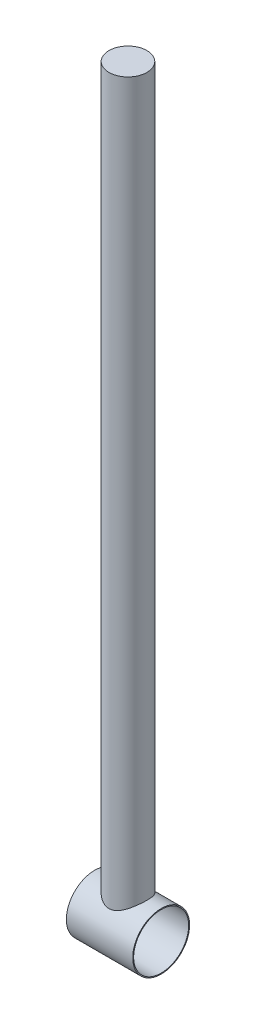
ISO-10303-21;
HEADER;
FILE_DESCRIPTION(('STEP AP214'),'2;1');
FILE_NAME('part.step','',(''),(''),'','','');
FILE_SCHEMA(('AUTOMOTIVE_DESIGN { 1 0 10303 214 1 1 1 1 }'));
ENDSEC;
DATA;
#1=APPLICATION_CONTEXT('core data for automotive mechanical design processes');
#2=APPLICATION_PROTOCOL_DEFINITION('international standard','automotive_design',2000,#1);
#3=PRODUCT_CONTEXT('',#1,'mechanical');
#4=PRODUCT('Part','Part','',(#3));
#5=PRODUCT_RELATED_PRODUCT_CATEGORY('part','',(#4));
#6=PRODUCT_DEFINITION_FORMATION('','',#4);
#7=PRODUCT_DEFINITION_CONTEXT('part definition',#1,'design');
#8=PRODUCT_DEFINITION('design','',#6,#7);
#9=PRODUCT_DEFINITION_SHAPE('','',#8);
#10=(LENGTH_UNIT() NAMED_UNIT(*) SI_UNIT(.MILLI.,.METRE.));
#11=(NAMED_UNIT(*) PLANE_ANGLE_UNIT() SI_UNIT($,.RADIAN.));
#12=(NAMED_UNIT(*) SI_UNIT($,.STERADIAN.) SOLID_ANGLE_UNIT());
#13=UNCERTAINTY_MEASURE_WITH_UNIT(LENGTH_MEASURE(1.E-05),#10,'distance_accuracy_value','');
#14=(GEOMETRIC_REPRESENTATION_CONTEXT(3) GLOBAL_UNCERTAINTY_ASSIGNED_CONTEXT((#13)) GLOBAL_UNIT_ASSIGNED_CONTEXT((#10,
#11,#12)) REPRESENTATION_CONTEXT('',''));
#15=CARTESIAN_POINT('',(0.,0.,0.));
#16=DIRECTION('',(0.,0.,1.));
#17=DIRECTION('',(1.,0.,0.));
#18=AXIS2_PLACEMENT_3D('',#15,#16,#17);
#19=CARTESIAN_POINT('',(35.,0.,0.));
#20=DIRECTION('',(1.,0.,0.));
#21=DIRECTION('',(0.,0.,-1.));
#22=AXIS2_PLACEMENT_3D('',#19,#20,#21);
#23=PLANE('',#22);
#24=CARTESIAN_POINT('',(35.,0.,0.));
#25=DIRECTION('',(1.,0.,0.));
#26=DIRECTION('',(0.,0.,-1.));
#27=AXIS2_PLACEMENT_3D('',#24,#25,#26);
#28=CIRCLE('',#27,30.);
#29=CARTESIAN_POINT('',(35.,0.,-30.));
#30=VERTEX_POINT('',#29);
#31=EDGE_CURVE('E10',#30,#30,#28,.T.);
#32=ORIENTED_EDGE('',*,*,#31,.T.);
#33=EDGE_LOOP('',(#32));
#34=FACE_BOUND('',#33,.T.);
#35=CARTESIAN_POINT('',(35.,0.,0.));
#36=DIRECTION('',(1.,0.,0.));
#37=DIRECTION('',(0.,0.,-1.));
#38=AXIS2_PLACEMENT_3D('',#35,#36,#37);
#39=CIRCLE('',#38,29.);
#40=CARTESIAN_POINT('',(35.,0.,-29.));
#41=VERTEX_POINT('',#40);
#42=EDGE_CURVE('E43',#41,#41,#39,.T.);
#43=ORIENTED_EDGE('',*,*,#42,.F.);
#44=EDGE_LOOP('',(#43));
#45=FACE_BOUND('',#44,.T.);
#46=ADVANCED_FACE('F32',(#34,#45),#23,.T.);
#47=CARTESIAN_POINT('',(-35.,0.,0.));
#48=DIRECTION('',(1.,0.,0.));
#49=DIRECTION('',(0.,0.,-1.));
#50=AXIS2_PLACEMENT_3D('',#47,#48,#49);
#51=PLANE('',#50);
#52=CARTESIAN_POINT('',(-35.,0.,0.));
#53=DIRECTION('',(1.,0.,0.));
#54=DIRECTION('',(0.,0.,-1.));
#55=AXIS2_PLACEMENT_3D('',#52,#53,#54);
#56=CIRCLE('',#55,30.);
#57=CARTESIAN_POINT('',(-35.,0.,-30.));
#58=VERTEX_POINT('',#57);
#59=EDGE_CURVE('E36',#58,#58,#56,.T.);
#60=ORIENTED_EDGE('',*,*,#59,.F.);
#61=EDGE_LOOP('',(#60));
#62=FACE_BOUND('',#61,.T.);
#63=CARTESIAN_POINT('',(-35.,0.,0.));
#64=DIRECTION('',(1.,0.,0.));
#65=DIRECTION('',(0.,0.,-1.));
#66=AXIS2_PLACEMENT_3D('',#63,#64,#65);
#67=CIRCLE('',#66,29.);
#68=CARTESIAN_POINT('',(-35.,0.,-29.));
#69=VERTEX_POINT('',#68);
#70=EDGE_CURVE('E45',#69,#69,#67,.T.);
#71=ORIENTED_EDGE('',*,*,#70,.T.);
#72=EDGE_LOOP('',(#71));
#73=FACE_BOUND('',#72,.T.);
#74=ADVANCED_FACE('F75',(#62,#73),#51,.F.);
#75=CARTESIAN_POINT('',(35.,0.,0.));
#76=DIRECTION('',(-1.,0.,0.));
#77=DIRECTION('',(0.,0.,1.));
#78=AXIS2_PLACEMENT_3D('',#75,#76,#77);
#79=CYLINDRICAL_SURFACE('',#78,30.);
#80=CARTESIAN_POINT('',(0.,22.3606797749979,20.));
#81=CARTESIAN_POINT('',(0.488208956169302,22.3606858935288,19.9999964119226));
#82=CARTESIAN_POINT('',(0.976468291774058,22.3767415723571,19.9820866285813));
#83=CARTESIAN_POINT('',(1.94835881250643,22.4401594085095,19.9108373861768));
#84=CARTESIAN_POINT('',(2.43198924712352,22.4875265581483,19.8574922772833));
#85=CARTESIAN_POINT('',(3.39112332136817,22.6113496939203,19.7163799196857));
#86=CARTESIAN_POINT('',(3.8666135294044,22.6878496694561,19.6285606101056));
#87=CARTESIAN_POINT('',(4.80533737323533,22.8665434498395,19.4200919600602));
#88=CARTESIAN_POINT('',(5.26857077190595,22.9687377513765,19.2994419849513));
#89=CARTESIAN_POINT('',(6.17578513914899,23.193728226989,19.0284426273943));
#90=CARTESIAN_POINT('',(6.6199111296105,23.3163108203906,18.8783985352891));
#91=CARTESIAN_POINT('',(7.49212487931457,23.5787801839215,18.5495380856482));
#92=CARTESIAN_POINT('',(7.92020999413462,23.7186697909934,18.3707170095788));
#93=CARTESIAN_POINT('',(8.75912421482544,24.0118255935988,17.9858478768931));
#94=CARTESIAN_POINT('',(9.16995442032433,24.1650909347959,17.7798015587787));
#95=CARTESIAN_POINT('',(9.97362051230805,24.4813525241294,17.3417522052945));
#96=CARTESIAN_POINT('',(10.3664551510918,24.644349445194,17.1097473739498));
#97=CARTESIAN_POINT('',(11.1932268211757,25.00257367896,16.5827611461459));
#98=CARTESIAN_POINT('',(11.6240409428177,25.1988679806497,16.2835985891376));
#99=CARTESIAN_POINT('',(12.4598274059487,25.5951544496233,15.6533280846079));
#100=CARTESIAN_POINT('',(12.8647979980787,25.7951468660549,15.3222179783466));
#101=CARTESIAN_POINT('',(13.6481434866574,26.194621993879,14.6288076134715));
#102=CARTESIAN_POINT('',(14.0264936382841,26.3941040691864,14.2664790139786));
#103=CARTESIAN_POINT('',(14.7548145893199,26.788258639696,13.5118632099609));
#104=CARTESIAN_POINT('',(15.1047834311923,26.9829308025026,13.1195739425843));
#105=CARTESIAN_POINT('',(15.8231340954399,27.3910931463656,12.2471310095378));
#106=CARTESIAN_POINT('',(16.1868495528045,27.6032288530363,11.7624780965832));
#107=CARTESIAN_POINT('',(16.8717372344808,28.0103500677694,10.7570654072488));
#108=CARTESIAN_POINT('',(17.1929043262227,28.2053335058183,10.2363012863295));
#109=CARTESIAN_POINT('',(17.7887598687195,28.5724511444835,9.1617184714881));
#110=CARTESIAN_POINT('',(18.0634871779264,28.7446044219641,8.60792794262454));
#111=CARTESIAN_POINT('',(18.5627727588207,29.0609568759301,7.4705384998476));
#112=CARTESIAN_POINT('',(18.7873417767955,29.205162039351,6.88694600391358));
#113=CARTESIAN_POINT('',(19.1602240381012,29.4464999554022,5.76165832972233));
#114=CARTESIAN_POINT('',(19.3142641521887,29.5470977395677,5.22260227045826));
#115=CARTESIAN_POINT('',(19.5772038937651,29.7196407127317,4.12906673821278));
#116=CARTESIAN_POINT('',(19.6861065662819,29.7915878345267,3.57458830833749));
#117=CARTESIAN_POINT('',(19.8566974647913,29.904587508942,2.45588842993637));
#118=CARTESIAN_POINT('',(19.9184351137685,29.9456724005222,1.89167781543662));
#119=CARTESIAN_POINT('',(19.9936647349202,29.9957633041667,0.7586590887696));
#120=CARTESIAN_POINT('',(20.007163514351,30.0047738424215,0.189851636642885));
#121=CARTESIAN_POINT('',(19.9873184370662,29.9915473981852,-0.859806415927934));
#122=CARTESIAN_POINT('',(19.9607940358833,29.9738593639155,-1.34086232409546));
#123=CARTESIAN_POINT('',(19.873310019839,29.9156709892741,-2.2983895351906));
#124=CARTESIAN_POINT('',(19.8123548499873,29.8751735935912,-2.7748614218412));
#125=CARTESIAN_POINT('',(19.6568520909165,29.7722764488344,-3.7198828753724));
#126=CARTESIAN_POINT('',(19.5623030441721,29.7098757494512,-4.18843209759108));
#127=CARTESIAN_POINT('',(19.3408382238798,29.5645234505635,-5.11455664152083));
#128=CARTESIAN_POINT('',(19.2139210515152,29.4815709628999,-5.57213148802944));
#129=CARTESIAN_POINT('',(18.9298040334638,29.2971987002846,-6.47179810816159));
#130=CARTESIAN_POINT('',(18.7727295883957,29.1958554904912,-6.91394533614488));
#131=CARTESIAN_POINT('',(18.4296096664266,28.9764235265008,-7.78251525709052));
#132=CARTESIAN_POINT('',(18.2435647019401,28.858335068488,-8.20893822800989));
#133=CARTESIAN_POINT('',(17.8441778455769,28.6075257726395,-9.04431763466509));
#134=CARTESIAN_POINT('',(17.6308352556287,28.4748045606182,-9.45327362336785));
#135=CARTESIAN_POINT('',(17.1784769804029,28.1969539999433,-10.2523545489443));
#136=CARTESIAN_POINT('',(16.9394582795807,28.0518231942476,-10.6424772661187));
#137=CARTESIAN_POINT('',(16.4042840153249,27.7317267401802,-11.4527356062426));
#138=CARTESIAN_POINT('',(16.1047473885238,27.5553463717531,-11.8700812163928));
#139=CARTESIAN_POINT('',(15.4767499308217,27.1930871485775,-12.6780149842778));
#140=CARTESIAN_POINT('',(15.1482869484778,27.007207587744,-13.0686011478891));
#141=CARTESIAN_POINT('',(14.463625347029,26.6292105400492,-13.8225619123957));
#142=CARTESIAN_POINT('',(14.107387635318,26.4370844912714,-14.185896693865));
#143=CARTESIAN_POINT('',(13.3689696755022,26.0505351068054,-14.883843396687));
#144=CARTESIAN_POINT('',(12.9867881329827,25.8561116568934,-15.2184538830105));
#145=CARTESIAN_POINT('',(12.1362208652914,25.4387487342262,-15.9077512722913));
#146=CARTESIAN_POINT('',(11.6636681752519,25.2160728404677,-16.2574779985587));
#147=CARTESIAN_POINT('',(10.6867448691347,24.7793365815512,-16.9156894234147));
#148=CARTESIAN_POINT('',(10.1823671315698,24.5652781624035,-17.2241648426867));
#149=CARTESIAN_POINT('',(9.14376134489059,24.1532936665152,-17.7972680129957));
#150=CARTESIAN_POINT('',(8.60957393087465,23.9553464914574,-18.0619535936899));
#151=CARTESIAN_POINT('',(7.78719238261373,23.6764424287916,-18.4241508744694));
#152=CARTESIAN_POINT('',(7.50958963683994,23.586488758667,-18.539064186288));
#153=CARTESIAN_POINT('',(6.94749503984161,23.4135888725702,-18.7569503816948));
#154=CARTESIAN_POINT('',(6.66300152644001,23.3306443694362,-18.8599203489511));
#155=CARTESIAN_POINT('',(5.96407091868975,23.1390114191645,-19.0949737019528));
#156=CARTESIAN_POINT('',(5.54626140545961,23.0345499403737,-19.2205883140043));
#157=CARTESIAN_POINT('',(4.69922231908342,22.8454014192454,-19.4450303060951));
#158=CARTESIAN_POINT('',(4.26999589657128,22.7607089831938,-19.5438649938583));
#159=CARTESIAN_POINT('',(3.40278811100768,22.6140815263718,-19.7133430846625));
#160=CARTESIAN_POINT('',(2.96482019952331,22.5521140132966,-19.78402675084));
#161=CARTESIAN_POINT('',(2.08233638909669,22.4531500088269,-19.8962732778957));
#162=CARTESIAN_POINT('',(1.63782046369869,22.4161536183507,-19.9378360210846));
#163=CARTESIAN_POINT('',(0.743602003114596,22.3685666502113,-19.9912114344644));
#164=CARTESIAN_POINT('',(0.293885240116605,22.3580932385861,-20.0028921020166));
#165=CARTESIAN_POINT('',(-0.605120297999129,22.3643493087133,-19.9958970388908));
#166=CARTESIAN_POINT('',(-1.05440907208809,22.3810788556911,-19.9772212354264));
#167=CARTESIAN_POINT('',(-1.9492428602337,22.4410353821841,-19.9098452800438));
#168=CARTESIAN_POINT('',(-2.39478497674719,22.4842812448844,-19.8611237313693));
#169=CARTESIAN_POINT('',(-3.27854030433162,22.5954993646352,-19.7344995148557));
#170=CARTESIAN_POINT('',(-3.71675339276235,22.6634720350192,-19.6565963592159));
#171=CARTESIAN_POINT('',(-4.56177482159982,22.8176625120601,-19.4773587360434));
#172=CARTESIAN_POINT('',(-4.9690663661839,22.9028156744357,-19.3773687153742));
#173=CARTESIAN_POINT('',(-5.7729769048643,23.0905696500378,-19.1532490632813));
#174=CARTESIAN_POINT('',(-6.16959170710487,23.193177203668,-19.0291101035355));
#175=CARTESIAN_POINT('',(-6.95065639455215,23.4130553221982,-18.7579126655137));
#176=CARTESIAN_POINT('',(-7.33510717762389,23.5303248016759,-18.6108558836455));
#177=CARTESIAN_POINT('',(-8.0910039230564,23.7768089487606,-18.2949037795793));
#178=CARTESIAN_POINT('',(-8.46244798787663,23.9060253493674,-18.1260052876392));
#179=CARTESIAN_POINT('',(-9.26453201163456,24.2005356466709,-17.731501269301));
#180=CARTESIAN_POINT('',(-9.69216720830649,24.3678787987211,-17.5013086005028));
#181=CARTESIAN_POINT('',(-10.5268797585094,24.7117489529602,-17.0123139239897));
#182=CARTESIAN_POINT('',(-10.9339551810086,24.8882768146534,-16.7535092362064));
#183=CARTESIAN_POINT('',(-11.7272393872389,25.246838016415,-16.2081390990384));
#184=CARTESIAN_POINT('',(-12.1134251136209,25.4288771074696,-15.9215439116551));
#185=CARTESIAN_POINT('',(-12.863686505644,25.7947122322757,-15.3217576930428));
#186=CARTESIAN_POINT('',(-13.2277606863969,25.9785083830645,-15.0085648790455));
#187=CARTESIAN_POINT('',(-14.010022924438,26.3845748584298,-14.2850209466698));
#188=CARTESIAN_POINT('',(-14.4226354817809,26.6064699077529,-13.868399953091));
#189=CARTESIAN_POINT('',(-15.2116275793937,27.0422910024591,-12.9981303927617));
#190=CARTESIAN_POINT('',(-15.5880004523266,27.2562155770218,-12.5444750407321));
#191=CARTESIAN_POINT('',(-16.3015809622043,27.6705120036506,-11.6020484650165));
#192=CARTESIAN_POINT('',(-16.6388155779588,27.8708931512095,-11.1133018111967));
#193=CARTESIAN_POINT('',(-17.2712189380549,28.2529916116302,-10.1024838029969));
#194=CARTESIAN_POINT('',(-17.5663989619658,28.4347139253593,-9.58042143890714));
#195=CARTESIAN_POINT('',(-18.0588559388184,28.7418292040784,-8.60898698059616));
#196=CARTESIAN_POINT('',(-18.2640476187588,28.871337394815,-8.16491313347023));
#197=CARTESIAN_POINT('',(-18.6427436665588,29.11237793097,-7.25872966066563));
#198=CARTESIAN_POINT('',(-18.8162516453839,29.2239123246767,-6.79662209756982));
#199=CARTESIAN_POINT('',(-19.1295452645597,29.4266077341683,-5.8570926543953));
#200=CARTESIAN_POINT('',(-19.2693535082187,29.5177824027246,-5.37968128385402));
#201=CARTESIAN_POINT('',(-19.5136219644057,29.6778186712604,-4.41219358714587));
#202=CARTESIAN_POINT('',(-19.6180816641359,29.746679947541,-3.92211707735807));
#203=CARTESIAN_POINT('',(-19.7905605262366,29.8607111976658,-2.93054121015943));
#204=CARTESIAN_POINT('',(-19.8584133272705,29.9057729947659,-2.42900032455899));
#205=CARTESIAN_POINT('',(-19.9559150035461,29.9706058238814,-1.42057881685205));
#206=CARTESIAN_POINT('',(-19.985563818304,29.990376815857,-0.913698186293017));
#207=CARTESIAN_POINT('',(-20.0061827922548,30.0041212399487,0.101169392531049));
#208=CARTESIAN_POINT('',(-19.9971552556599,29.9980962089087,0.6091562730871));
#209=CARTESIAN_POINT('',(-19.9405705458765,29.9604056252688,1.6219998853204));
#210=CARTESIAN_POINT('',(-19.8930151261764,29.9287412395721,2.12685675839747));
#211=CARTESIAN_POINT('',(-19.7649794259347,29.8437985658208,3.09279975247605));
#212=CARTESIAN_POINT('',(-19.687150146037,29.7922629250282,3.55439520403423));
#213=CARTESIAN_POINT('',(-19.5000321223317,29.6689450523963,4.46836902451358));
#214=CARTESIAN_POINT('',(-19.3907452072019,29.597163997457,4.92074792756969));
#215=CARTESIAN_POINT('',(-19.1419956701691,29.4347944617127,5.81367709229976));
#216=CARTESIAN_POINT('',(-19.0025311498945,29.344204797736,6.25422660786602));
#217=CARTESIAN_POINT('',(-18.6949126651676,29.1459419809342,7.12122590088722));
#218=CARTESIAN_POINT('',(-18.5267571866793,29.0382679265783,7.54767493283414));
#219=CARTESIAN_POINT('',(-18.1528283168397,28.8010951909527,8.40878779714676));
#220=CARTESIAN_POINT('',(-17.9454426246028,28.670694888708,8.84250227551099));
#221=CARTESIAN_POINT('',(-17.5022026754717,28.3953682076704,9.69029143409239));
#222=CARTESIAN_POINT('',(-17.2663476127158,28.2504414177065,10.104365557902));
#223=CARTESIAN_POINT('',(-16.7678351398796,27.9485407408145,10.9116855558948));
#224=CARTESIAN_POINT('',(-16.5051663004555,27.7915617237644,11.3049224388242));
#225=CARTESIAN_POINT('',(-15.9547049296104,27.4682178656632,12.0693531593152));
#226=CARTESIAN_POINT('',(-15.6669095826824,27.3018519735229,12.4405445187535));
#227=CARTESIAN_POINT('',(-15.0204704992175,26.9357159197241,13.2166207315212));
#228=CARTESIAN_POINT('',(-14.6578028483683,26.7348072575091,13.6176230440809));
#229=CARTESIAN_POINT('',(-13.9025385930368,26.3282976577339,14.3878567191196));
#230=CARTESIAN_POINT('',(-13.5099380886709,26.1226961112019,14.757083928306));
#231=CARTESIAN_POINT('',(-12.6960054650691,25.7111873767681,15.4629181005339));
#232=CARTESIAN_POINT('',(-12.2746525915669,25.5052800753153,15.7995010665117));
#233=CARTESIAN_POINT('',(-11.4046784566367,25.0981854077811,16.4385088149114));
#234=CARTESIAN_POINT('',(-10.9560598425279,24.8969975860907,16.7409369054171));
#235=CARTESIAN_POINT('',(-10.0678167363029,24.519622725546,17.288437587054));
#236=CARTESIAN_POINT('',(-9.63011792851659,24.3426994009277,17.536125801145));
#237=CARTESIAN_POINT('',(-8.7331555306482,24.0019984692107,17.9996334824726));
#238=CARTESIAN_POINT('',(-8.27389129214839,23.838221257784,18.2154519906584));
#239=CARTESIAN_POINT('',(-7.33576452239174,23.5290813254498,18.6130511835398));
#240=CARTESIAN_POINT('',(-6.8569347106357,23.3836894022856,18.7948860714089));
#241=CARTESIAN_POINT('',(-5.88083845965279,23.1163199010043,19.1227764985235));
#242=CARTESIAN_POINT('',(-5.38357708340433,22.9943359489798,19.268841780706));
#243=CARTESIAN_POINT('',(-4.4853911912487,22.802875861737,19.4947592055363));
#244=CARTESIAN_POINT('',(-4.08754467830019,22.7277543004783,19.5821115045836));
#245=CARTESIAN_POINT('',(-3.28415884670264,22.5970955375622,19.7327455746581));
#246=CARTESIAN_POINT('',(-2.8786207162801,22.541555336465,19.7960310323203));
#247=CARTESIAN_POINT('',(-2.06234621278792,22.4519236803042,19.8976315087765));
#248=CARTESIAN_POINT('',(-1.65161370745007,22.4178171262643,19.9359641063474));
#249=CARTESIAN_POINT('',(-0.827266419755447,22.3721912092578,19.9871514199303));
#250=CARTESIAN_POINT('',(-0.413651293298562,22.3606745908688,20.0000030401181));
#251=CARTESIAN_POINT('',(0.,22.3606797749979,20.));
#252=B_SPLINE_CURVE_WITH_KNOTS('',3,(#80,#81,#82,#83,#84,#85,#86,#87,#88,#89,#90,#91,#92,#93,
#94,#95,#96,#97,#98,#99,#100,#101,#102,#103,#104,#105,#106,#107,#108,#109,#110,#111,#112,#113,
#114,#115,#116,#117,#118,#119,#120,#121,#122,#123,#124,#125,#126,#127,#128,#129,#130,#131,#132,
#133,#134,#135,#136,#137,#138,#139,#140,#141,#142,#143,#144,#145,#146,#147,#148,#149,#150,#151,
#152,#153,#154,#155,#156,#157,#158,#159,#160,#161,#162,#163,#164,#165,#166,#167,#168,#169,#170,
#171,#172,#173,#174,#175,#176,#177,#178,#179,#180,#181,#182,#183,#184,#185,#186,#187,#188,#189,
#190,#191,#192,#193,#194,#195,#196,#197,#198,#199,#200,#201,#202,#203,#204,#205,#206,#207,#208,
#209,#210,#211,#212,#213,#214,#215,#216,#217,#218,#219,#220,#221,#222,#223,#224,#225,#226,#227,
#228,#229,#230,#231,#232,#233,#234,#235,#236,#237,#238,#239,#240,#241,#242,#243,#244,#245,#246,
#247,#248,#249,#250,#251),.UNSPECIFIED.,.T.,.F.,(4,2,2,2,2,2,2,2,2,2,2,2,2,2,2,2,2,2,2,2,2,2,2,
2,2,2,2,2,2,2,2,2,2,2,2,2,2,2,2,2,2,2,2,2,2,2,2,2,2,2,2,2,2,2,2,2,2,2,2,2,2,2,2,2,2,2,2,2,2,2,2,
2,2,2,2,2,2,2,2,2,2,2,2,2,2,4),(0.,1.46413383476119,2.92850116798433,4.3950884612604,
5.86170410688106,7.31382579475252,8.76618582863999,10.2184531650402,11.6708210407287,
13.3493094048912,15.0279112663608,16.7080533902126,18.3883112996803,20.3117642438544,
22.2354490015051,24.1575160629544,26.079170930532,27.7853619359246,29.4914378208096,
31.1957234922769,32.8997686529781,34.3443503382155,35.7887455706705,37.2332034782288,
38.6777238198782,40.1163627603301,41.5549762578204,42.9936265517613,44.4324459938663,
46.0602839475324,47.6882430766068,49.3185364037738,50.9489111309836,52.8326361759336,
54.7167842470655,56.5984238649026,57.5389749114896,58.4797551409555,59.8242529017226,
61.1683834046849,62.5105844944299,63.8527910085193,65.2009164973756,66.5490452186684,
67.8981351058559,69.2472475454816,70.529851328563,71.8129515469024,73.0959568335221,
74.3791485235474,75.9187799981372,77.4585558113539,78.999997879572,80.5415433482356,
82.4201756779315,84.2991529785491,86.1768272700558,88.053996993814,89.5706110260009,
91.0870521029024,92.6024732144332,94.1179163090846,95.6401895843999,97.1624652697504,
98.6846502640925,100.206765984357,101.617993966733,103.029139928947,104.440374687427,
105.851683940514,107.344548709883,108.837455746597,110.331001811733,111.824715448892,
113.553354854051,115.282219865862,117.012346298594,118.742305015278,120.340261559248,
121.93826618052,123.53369984988,125.128698469926,126.370149556428,127.611410396842,
128.851795845449,130.092331986087),.UNSPECIFIED.);
#253=CARTESIAN_POINT('',(0.,22.3606797749979,20.));
#254=VERTEX_POINT('',#253);
#255=EDGE_CURVE('E48',#254,#254,#252,.T.);
#256=ORIENTED_EDGE('',*,*,#255,.F.);
#257=EDGE_LOOP('',(#256));
#258=FACE_BOUND('',#257,.T.);
#259=ORIENTED_EDGE('',*,*,#31,.F.);
#260=EDGE_LOOP('',(#259));
#261=FACE_BOUND('',#260,.T.);
#262=ORIENTED_EDGE('',*,*,#59,.T.);
#263=EDGE_LOOP('',(#262));
#264=FACE_BOUND('',#263,.T.);
#265=ADVANCED_FACE('F34',(#258,#261,#264),#79,.T.);
#266=CARTESIAN_POINT('',(35.,0.,0.));
#267=DIRECTION('',(-1.,0.,0.));
#268=DIRECTION('',(0.,0.,1.));
#269=AXIS2_PLACEMENT_3D('',#266,#267,#268);
#270=CYLINDRICAL_SURFACE('',#269,29.);
#271=ORIENTED_EDGE('',*,*,#42,.T.);
#272=EDGE_LOOP('',(#271));
#273=FACE_BOUND('',#272,.T.);
#274=ORIENTED_EDGE('',*,*,#70,.F.);
#275=EDGE_LOOP('',(#274));
#276=FACE_BOUND('',#275,.T.);
#277=ADVANCED_FACE('F65',(#273,#276),#270,.F.);
#278=CARTESIAN_POINT('',(0.,786.,0.));
#279=DIRECTION('',(0.,1.,0.));
#280=DIRECTION('',(0.,0.,1.));
#281=AXIS2_PLACEMENT_3D('',#278,#279,#280);
#282=PLANE('',#281);
#283=CARTESIAN_POINT('',(0.,786.,0.));
#284=DIRECTION('',(0.,1.,0.));
#285=DIRECTION('',(0.,0.,1.));
#286=AXIS2_PLACEMENT_3D('',#283,#284,#285);
#287=CIRCLE('',#286,20.);
#288=CARTESIAN_POINT('',(0.,786.,20.));
#289=VERTEX_POINT('',#288);
#290=EDGE_CURVE('E57',#289,#289,#287,.T.);
#291=ORIENTED_EDGE('',*,*,#290,.T.);
#292=EDGE_LOOP('',(#291));
#293=FACE_BOUND('',#292,.T.);
#294=ADVANCED_FACE('F63',(#293),#282,.T.);
#295=CARTESIAN_POINT('',(0.,-30.0009999999999,0.));
#296=DIRECTION('',(0.,1.,0.));
#297=DIRECTION('',(0.,0.,1.));
#298=AXIS2_PLACEMENT_3D('',#295,#296,#297);
#299=CYLINDRICAL_SURFACE('',#298,20.);
#300=ORIENTED_EDGE('',*,*,#290,.F.);
#301=EDGE_LOOP('',(#300));
#302=FACE_BOUND('',#301,.T.);
#303=ORIENTED_EDGE('',*,*,#255,.T.);
#304=EDGE_LOOP('',(#303));
#305=FACE_BOUND('',#304,.T.);
#306=ADVANCED_FACE('F58',(#302,#305),#299,.T.);
#307=CLOSED_SHELL('',(#46,#74,#265,#277,#294,#306));
#308=MANIFOLD_SOLID_BREP('B2',#307);
#309=ADVANCED_BREP_SHAPE_REPRESENTATION('',(#18,#308),#14);
#310=SHAPE_DEFINITION_REPRESENTATION(#9,#309);
ENDSEC;
END-ISO-10303-21;
